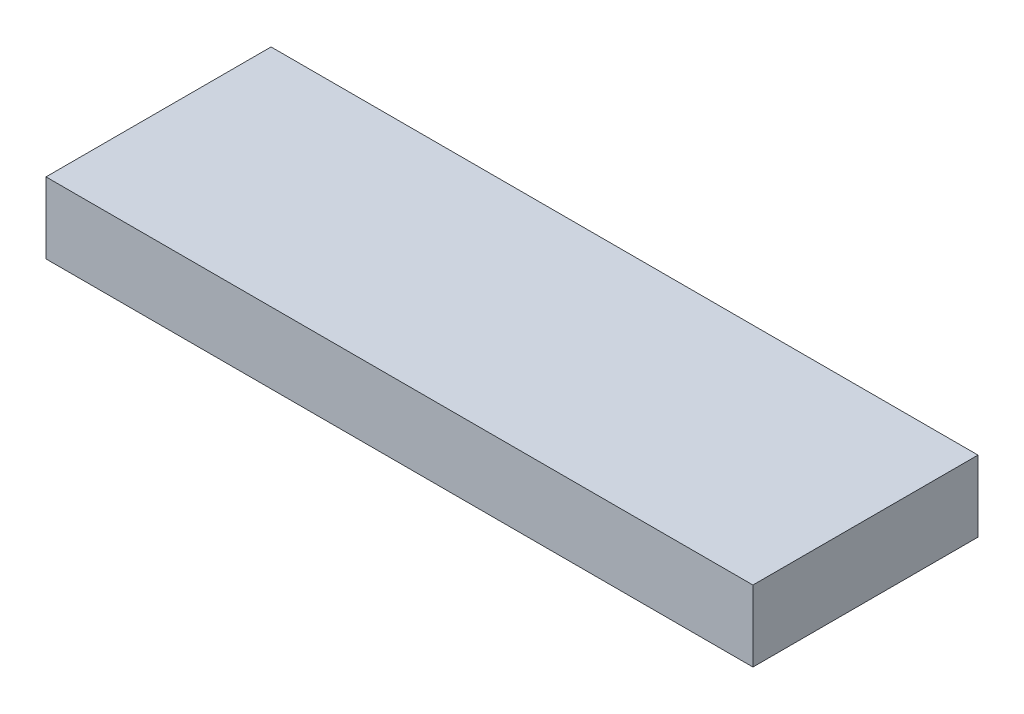
ISO-10303-21;
HEADER;
FILE_DESCRIPTION(('STEP AP214'),'2;1');
FILE_NAME('part.step','',(''),(''),'','','');
FILE_SCHEMA(('AUTOMOTIVE_DESIGN { 1 0 10303 214 1 1 1 1 }'));
ENDSEC;
DATA;
#1=APPLICATION_CONTEXT('core data for automotive mechanical design processes');
#2=APPLICATION_PROTOCOL_DEFINITION('international standard','automotive_design',2000,#1);
#3=PRODUCT_CONTEXT('',#1,'mechanical');
#4=PRODUCT('Part','Part','',(#3));
#5=PRODUCT_RELATED_PRODUCT_CATEGORY('part','',(#4));
#6=PRODUCT_DEFINITION_FORMATION('','',#4);
#7=PRODUCT_DEFINITION_CONTEXT('part definition',#1,'design');
#8=PRODUCT_DEFINITION('design','',#6,#7);
#9=PRODUCT_DEFINITION_SHAPE('','',#8);
#10=(LENGTH_UNIT() NAMED_UNIT(*) SI_UNIT(.MILLI.,.METRE.));
#11=(NAMED_UNIT(*) PLANE_ANGLE_UNIT() SI_UNIT($,.RADIAN.));
#12=(NAMED_UNIT(*) SI_UNIT($,.STERADIAN.) SOLID_ANGLE_UNIT());
#13=UNCERTAINTY_MEASURE_WITH_UNIT(LENGTH_MEASURE(1.E-05),#10,'distance_accuracy_value','');
#14=(GEOMETRIC_REPRESENTATION_CONTEXT(3) GLOBAL_UNCERTAINTY_ASSIGNED_CONTEXT((#13)) GLOBAL_UNIT_ASSIGNED_CONTEXT((#10,
#11,#12)) REPRESENTATION_CONTEXT('',''));
#15=CARTESIAN_POINT('',(0.,0.,0.));
#16=DIRECTION('',(0.,0.,1.));
#17=DIRECTION('',(1.,0.,0.));
#18=AXIS2_PLACEMENT_3D('',#15,#16,#17);
#19=CARTESIAN_POINT('',(0.,0.,0.));
#20=DIRECTION('',(0.,0.,1.));
#21=DIRECTION('',(1.,0.,0.));
#22=AXIS2_PLACEMENT_3D('',#19,#20,#21);
#23=PLANE('',#22);
#24=CARTESIAN_POINT('',(152.911233663559,-9.52500000000001,0.));
#25=DIRECTION('',(0.,0.,1.));
#26=DIRECTION('',(1.,0.,0.));
#27=AXIS2_PLACEMENT_3D('',#24,#25,#26);
#28=CIRCLE('',#27,1.58749999999999);
#29=CARTESIAN_POINT('',(154.498733663559,-9.52500000000001,0.));
#30=VERTEX_POINT('',#29);
#31=EDGE_CURVE('E39',#30,#30,#28,.T.);
#32=ORIENTED_EDGE('',*,*,#31,.T.);
#33=EDGE_LOOP('',(#32));
#34=FACE_BOUND('',#33,.T.);
#35=CARTESIAN_POINT('',(228.6,-9.525,0.));
#36=DIRECTION('',(0.,0.,1.));
#37=DIRECTION('',(1.,0.,0.));
#38=AXIS2_PLACEMENT_3D('',#35,#36,#37);
#39=CIRCLE('',#38,1.58749999999999);
#40=CARTESIAN_POINT('',(230.1875,-9.525,0.));
#41=VERTEX_POINT('',#40);
#42=EDGE_CURVE('E97',#41,#41,#39,.T.);
#43=ORIENTED_EDGE('',*,*,#42,.T.);
#44=EDGE_LOOP('',(#43));
#45=FACE_BOUND('',#44,.T.);
#46=CARTESIAN_POINT('',(304.288766336441,-9.52500000000003,0.));
#47=DIRECTION('',(0.,0.,1.));
#48=DIRECTION('',(1.,0.,0.));
#49=AXIS2_PLACEMENT_3D('',#46,#47,#48);
#50=CIRCLE('',#49,1.58750000000002);
#51=CARTESIAN_POINT('',(305.876266336441,-9.52500000000003,0.));
#52=VERTEX_POINT('',#51);
#53=EDGE_CURVE('E101',#52,#52,#50,.T.);
#54=ORIENTED_EDGE('',*,*,#53,.T.);
#55=EDGE_LOOP('',(#54));
#56=FACE_BOUND('',#55,.T.);
#57=DIRECTION('',(0.,-1.,0.));
#58=VECTOR('',#57,1.);
#59=CARTESIAN_POINT('',(133.861233663559,0.,0.));
#60=LINE('',#59,#58);
#61=CARTESIAN_POINT('',(133.861233663559,0.,0.));
#62=VERTEX_POINT('',#61);
#63=CARTESIAN_POINT('',(133.861233663559,-19.05,0.));
#64=VERTEX_POINT('',#63);
#65=EDGE_CURVE('E106',#62,#64,#60,.T.);
#66=ORIENTED_EDGE('',*,*,#65,.F.);
#67=DIRECTION('',(-1.,0.,0.));
#68=VECTOR('',#67,1.);
#69=CARTESIAN_POINT('',(133.861233663559,0.,0.));
#70=LINE('',#69,#68);
#71=CARTESIAN_POINT('',(323.338766336441,0.,0.));
#72=VERTEX_POINT('',#71);
#73=EDGE_CURVE('E115',#72,#62,#70,.T.);
#74=ORIENTED_EDGE('',*,*,#73,.F.);
#75=DIRECTION('',(0.,1.,0.));
#76=VECTOR('',#75,1.);
#77=CARTESIAN_POINT('',(323.338766336441,0.,0.));
#78=LINE('',#77,#76);
#79=CARTESIAN_POINT('',(323.338766336441,-19.05,0.));
#80=VERTEX_POINT('',#79);
#81=EDGE_CURVE('E112',#80,#72,#78,.T.);
#82=ORIENTED_EDGE('',*,*,#81,.F.);
#83=DIRECTION('',(1.,0.,0.));
#84=VECTOR('',#83,1.);
#85=CARTESIAN_POINT('',(133.861233663559,-19.05,0.));
#86=LINE('',#85,#84);
#87=EDGE_CURVE('E109',#64,#80,#86,.T.);
#88=ORIENTED_EDGE('',*,*,#87,.F.);
#89=EDGE_LOOP('',(#66,#74,#82,#88));
#90=FACE_BOUND('',#89,.T.);
#91=ADVANCED_FACE('F35',(#34,#45,#56,#90),#23,.F.);
#92=CARTESIAN_POINT('',(133.861233663559,0.,250.757764743368));
#93=DIRECTION('',(0.,-1.,0.));
#94=DIRECTION('',(0.,0.,-1.));
#95=AXIS2_PLACEMENT_3D('',#92,#93,#94);
#96=PLANE('',#95);
#97=DIRECTION('',(0.,0.,-1.));
#98=VECTOR('',#97,1.);
#99=CARTESIAN_POINT('',(133.861233663559,0.,250.757764743368));
#100=LINE('',#99,#98);
#101=CARTESIAN_POINT('',(133.861233663559,0.,60.325));
#102=VERTEX_POINT('',#101);
#103=EDGE_CURVE('E118',#102,#62,#100,.T.);
#104=ORIENTED_EDGE('',*,*,#103,.F.);
#105=DIRECTION('',(1.,0.,0.));
#106=VECTOR('',#105,1.);
#107=CARTESIAN_POINT('',(133.861233663559,0.,60.325));
#108=LINE('',#107,#106);
#109=CARTESIAN_POINT('',(323.338766336441,0.,60.325));
#110=VERTEX_POINT('',#109);
#111=EDGE_CURVE('E56',#102,#110,#108,.T.);
#112=ORIENTED_EDGE('',*,*,#111,.T.);
#113=DIRECTION('',(0.,0.,-1.));
#114=VECTOR('',#113,1.);
#115=CARTESIAN_POINT('',(323.338766336441,0.,250.757764743368));
#116=LINE('',#115,#114);
#117=EDGE_CURVE('E120',#110,#72,#116,.T.);
#118=ORIENTED_EDGE('',*,*,#117,.T.);
#119=ORIENTED_EDGE('',*,*,#73,.T.);
#120=EDGE_LOOP('',(#104,#112,#118,#119));
#121=FACE_BOUND('',#120,.T.);
#122=ADVANCED_FACE('F150',(#121),#96,.F.);
#123=CARTESIAN_POINT('',(323.338766336441,0.,250.757764743368));
#124=DIRECTION('',(-1.,0.,0.));
#125=DIRECTION('',(0.,0.,1.));
#126=AXIS2_PLACEMENT_3D('',#123,#124,#125);
#127=PLANE('',#126);
#128=ORIENTED_EDGE('',*,*,#117,.F.);
#129=DIRECTION('',(0.,-1.,0.));
#130=VECTOR('',#129,1.);
#131=CARTESIAN_POINT('',(323.338766336441,0.,60.325));
#132=LINE('',#131,#130);
#133=CARTESIAN_POINT('',(323.338766336441,-19.05,60.325));
#134=VERTEX_POINT('',#133);
#135=EDGE_CURVE('E102',#110,#134,#132,.T.);
#136=ORIENTED_EDGE('',*,*,#135,.T.);
#137=DIRECTION('',(0.,0.,-1.));
#138=VECTOR('',#137,1.);
#139=CARTESIAN_POINT('',(323.338766336441,-19.05,250.757764743368));
#140=LINE('',#139,#138);
#141=EDGE_CURVE('E122',#134,#80,#140,.T.);
#142=ORIENTED_EDGE('',*,*,#141,.T.);
#143=ORIENTED_EDGE('',*,*,#81,.T.);
#144=EDGE_LOOP('',(#128,#136,#142,#143));
#145=FACE_BOUND('',#144,.T.);
#146=ADVANCED_FACE('F156',(#145),#127,.F.);
#147=CARTESIAN_POINT('',(133.861233663559,-19.05,250.757764743368));
#148=DIRECTION('',(0.,1.,0.));
#149=DIRECTION('',(-1.,0.,0.));
#150=AXIS2_PLACEMENT_3D('',#147,#148,#149);
#151=PLANE('',#150);
#152=ORIENTED_EDGE('',*,*,#141,.F.);
#153=DIRECTION('',(-1.,0.,0.));
#154=VECTOR('',#153,1.);
#155=CARTESIAN_POINT('',(133.861233663559,-19.05,60.325));
#156=LINE('',#155,#154);
#157=CARTESIAN_POINT('',(133.861233663559,-19.05,60.325));
#158=VERTEX_POINT('',#157);
#159=EDGE_CURVE('E44',#134,#158,#156,.T.);
#160=ORIENTED_EDGE('',*,*,#159,.T.);
#161=DIRECTION('',(0.,0.,-1.));
#162=VECTOR('',#161,1.);
#163=CARTESIAN_POINT('',(133.861233663559,-19.05,250.757764743368));
#164=LINE('',#163,#162);
#165=EDGE_CURVE('E124',#158,#64,#164,.T.);
#166=ORIENTED_EDGE('',*,*,#165,.T.);
#167=ORIENTED_EDGE('',*,*,#87,.T.);
#168=EDGE_LOOP('',(#152,#160,#166,#167));
#169=FACE_BOUND('',#168,.T.);
#170=ADVANCED_FACE('F163',(#169),#151,.F.);
#171=CARTESIAN_POINT('',(133.861233663559,0.,250.757764743368));
#172=DIRECTION('',(1.,0.,0.));
#173=DIRECTION('',(0.,0.,-1.));
#174=AXIS2_PLACEMENT_3D('',#171,#172,#173);
#175=PLANE('',#174);
#176=ORIENTED_EDGE('',*,*,#165,.F.);
#177=DIRECTION('',(0.,1.,0.));
#178=VECTOR('',#177,1.);
#179=CARTESIAN_POINT('',(133.861233663559,0.,60.325));
#180=LINE('',#179,#178);
#181=EDGE_CURVE('E11',#158,#102,#180,.T.);
#182=ORIENTED_EDGE('',*,*,#181,.T.);
#183=ORIENTED_EDGE('',*,*,#103,.T.);
#184=ORIENTED_EDGE('',*,*,#65,.T.);
#185=EDGE_LOOP('',(#176,#182,#183,#184));
#186=FACE_BOUND('',#185,.T.);
#187=ADVANCED_FACE('F37',(#186),#175,.F.);
#188=CARTESIAN_POINT('',(-209.037766336441,1.77870250412711E-12,60.325));
#189=DIRECTION('',(0.,0.,-1.));
#190=DIRECTION('',(0.,1.,0.));
#191=AXIS2_PLACEMENT_3D('',#188,#189,#190);
#192=PLANE('',#191);
#193=ORIENTED_EDGE('',*,*,#159,.F.);
#194=ORIENTED_EDGE('',*,*,#135,.F.);
#195=ORIENTED_EDGE('',*,*,#111,.F.);
#196=ORIENTED_EDGE('',*,*,#181,.F.);
#197=EDGE_LOOP('',(#193,#194,#195,#196));
#198=FACE_BOUND('',#197,.T.);
#199=ADVANCED_FACE('F160',(#198),#192,.F.);
#200=CARTESIAN_POINT('',(304.288766336441,-9.52500000000003,-25.4));
#201=DIRECTION('',(0.,0.,-1.));
#202=DIRECTION('',(-1.,0.,0.));
#203=AXIS2_PLACEMENT_3D('',#200,#201,#202);
#204=CYLINDRICAL_SURFACE('',#203,1.58750000000002);
#205=CARTESIAN_POINT('',(304.288766336441,-9.52500000000003,12.7));
#206=DIRECTION('',(0.,0.,-1.));
#207=DIRECTION('',(-1.,0.,0.));
#208=AXIS2_PLACEMENT_3D('',#205,#206,#207);
#209=CIRCLE('',#208,1.58750000000002);
#210=CARTESIAN_POINT('',(302.701266336441,-9.52500000000003,12.7));
#211=VERTEX_POINT('',#210);
#212=EDGE_CURVE('E98',#211,#211,#209,.T.);
#213=ORIENTED_EDGE('',*,*,#212,.F.);
#214=EDGE_LOOP('',(#213));
#215=FACE_BOUND('',#214,.T.);
#216=ORIENTED_EDGE('',*,*,#53,.F.);
#217=EDGE_LOOP('',(#216));
#218=FACE_BOUND('',#217,.T.);
#219=ADVANCED_FACE('F145',(#215,#218),#204,.F.);
#220=CARTESIAN_POINT('',(304.288766336441,-9.52500000000003,12.7));
#221=DIRECTION('',(0.,0.,-1.));
#222=DIRECTION('',(-1.,0.,0.));
#223=AXIS2_PLACEMENT_3D('',#220,#221,#222);
#224=CONICAL_SURFACE('',#223,1.58750000000002,1.02974425867666);
#225=CARTESIAN_POINT('',(304.288766336441,-9.52500000000003,13.6538662327063));
#226=VERTEX_POINT('',#225);
#227=VERTEX_LOOP('',#226);
#228=FACE_BOUND('',#227,.T.);
#229=ORIENTED_EDGE('',*,*,#212,.T.);
#230=EDGE_LOOP('',(#229));
#231=FACE_BOUND('',#230,.T.);
#232=ADVANCED_FACE('F136',(#228,#231),#224,.F.);
#233=CARTESIAN_POINT('',(228.6,-9.525,-25.4));
#234=DIRECTION('',(0.,0.,-1.));
#235=DIRECTION('',(-1.,0.,0.));
#236=AXIS2_PLACEMENT_3D('',#233,#234,#235);
#237=CYLINDRICAL_SURFACE('',#236,1.58749999999999);
#238=CARTESIAN_POINT('',(228.6,-9.525,12.7));
#239=DIRECTION('',(0.,0.,-1.));
#240=DIRECTION('',(-1.,0.,0.));
#241=AXIS2_PLACEMENT_3D('',#238,#239,#240);
#242=CIRCLE('',#241,1.58749999999999);
#243=CARTESIAN_POINT('',(227.0125,-9.525,12.7));
#244=VERTEX_POINT('',#243);
#245=EDGE_CURVE('E93',#244,#244,#242,.T.);
#246=ORIENTED_EDGE('',*,*,#245,.F.);
#247=EDGE_LOOP('',(#246));
#248=FACE_BOUND('',#247,.T.);
#249=ORIENTED_EDGE('',*,*,#42,.F.);
#250=EDGE_LOOP('',(#249));
#251=FACE_BOUND('',#250,.T.);
#252=ADVANCED_FACE('F133',(#248,#251),#237,.F.);
#253=CARTESIAN_POINT('',(228.6,-9.525,12.7));
#254=DIRECTION('',(0.,0.,-1.));
#255=DIRECTION('',(-1.,0.,0.));
#256=AXIS2_PLACEMENT_3D('',#253,#254,#255);
#257=CONICAL_SURFACE('',#256,1.58749999999999,1.02974425867665);
#258=CARTESIAN_POINT('',(228.6,-9.525,13.6538662327063));
#259=VERTEX_POINT('',#258);
#260=VERTEX_LOOP('',#259);
#261=FACE_BOUND('',#260,.T.);
#262=ORIENTED_EDGE('',*,*,#245,.T.);
#263=EDGE_LOOP('',(#262));
#264=FACE_BOUND('',#263,.T.);
#265=ADVANCED_FACE('F135',(#261,#264),#257,.F.);
#266=CARTESIAN_POINT('',(152.911233663559,-9.52500000000001,-25.4));
#267=DIRECTION('',(0.,0.,-1.));
#268=DIRECTION('',(-1.,0.,0.));
#269=AXIS2_PLACEMENT_3D('',#266,#267,#268);
#270=CYLINDRICAL_SURFACE('',#269,1.58749999999999);
#271=CARTESIAN_POINT('',(152.911233663559,-9.52500000000001,12.7));
#272=DIRECTION('',(0.,0.,-1.));
#273=DIRECTION('',(-1.,0.,0.));
#274=AXIS2_PLACEMENT_3D('',#271,#272,#273);
#275=CIRCLE('',#274,1.58749999999999);
#276=CARTESIAN_POINT('',(151.323733663559,-9.52500000000001,12.7));
#277=VERTEX_POINT('',#276);
#278=EDGE_CURVE('E89',#277,#277,#275,.T.);
#279=ORIENTED_EDGE('',*,*,#278,.F.);
#280=EDGE_LOOP('',(#279));
#281=FACE_BOUND('',#280,.T.);
#282=ORIENTED_EDGE('',*,*,#31,.F.);
#283=EDGE_LOOP('',(#282));
#284=FACE_BOUND('',#283,.T.);
#285=ADVANCED_FACE('F85',(#281,#284),#270,.F.);
#286=CARTESIAN_POINT('',(152.911233663559,-9.52500000000001,12.7));
#287=DIRECTION('',(0.,0.,-1.));
#288=DIRECTION('',(-1.,0.,0.));
#289=AXIS2_PLACEMENT_3D('',#286,#287,#288);
#290=CONICAL_SURFACE('',#289,1.58749999999999,1.02974425867665);
#291=CARTESIAN_POINT('',(152.911233663559,-9.52500000000001,13.6538662327063));
#292=VERTEX_POINT('',#291);
#293=VERTEX_LOOP('',#292);
#294=FACE_BOUND('',#293,.T.);
#295=ORIENTED_EDGE('',*,*,#278,.T.);
#296=EDGE_LOOP('',(#295));
#297=FACE_BOUND('',#296,.T.);
#298=ADVANCED_FACE('F82',(#294,#297),#290,.F.);
#299=CLOSED_SHELL('',(#91,#122,#146,#170,#187,#199,#219,#232,#252,#265,#285,#298));
#300=MANIFOLD_SOLID_BREP('B2',#299);
#301=ADVANCED_BREP_SHAPE_REPRESENTATION('',(#18,#300),#14);
#302=SHAPE_DEFINITION_REPRESENTATION(#9,#301);
ENDSEC;
END-ISO-10303-21;
